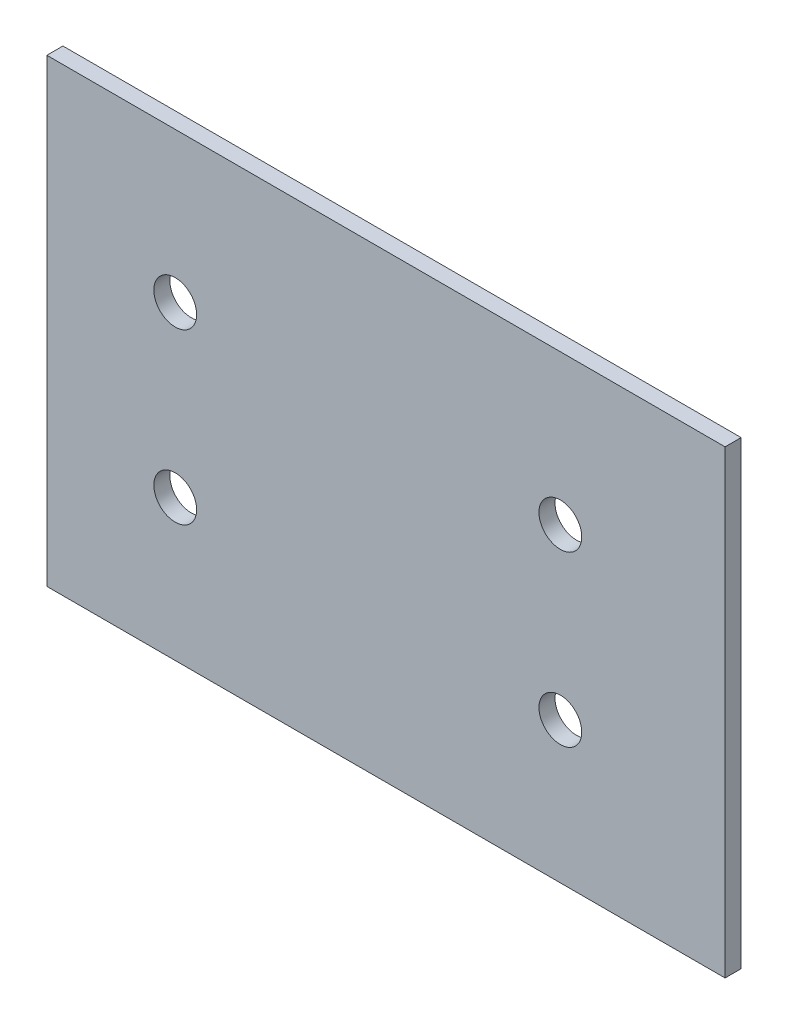
ISO-10303-21;
HEADER;
FILE_DESCRIPTION(('STEP AP214'),'2;1');
FILE_NAME('part.step','',(''),(''),'','','');
FILE_SCHEMA(('AUTOMOTIVE_DESIGN { 1 0 10303 214 1 1 1 1 }'));
ENDSEC;
DATA;
#1=APPLICATION_CONTEXT('core data for automotive mechanical design processes');
#2=APPLICATION_PROTOCOL_DEFINITION('international standard','automotive_design',2000,#1);
#3=PRODUCT_CONTEXT('',#1,'mechanical');
#4=PRODUCT('Part','Part','',(#3));
#5=PRODUCT_RELATED_PRODUCT_CATEGORY('part','',(#4));
#6=PRODUCT_DEFINITION_FORMATION('','',#4);
#7=PRODUCT_DEFINITION_CONTEXT('part definition',#1,'design');
#8=PRODUCT_DEFINITION('design','',#6,#7);
#9=PRODUCT_DEFINITION_SHAPE('','',#8);
#10=(LENGTH_UNIT() NAMED_UNIT(*) SI_UNIT(.MILLI.,.METRE.));
#11=(NAMED_UNIT(*) PLANE_ANGLE_UNIT() SI_UNIT($,.RADIAN.));
#12=(NAMED_UNIT(*) SI_UNIT($,.STERADIAN.) SOLID_ANGLE_UNIT());
#13=UNCERTAINTY_MEASURE_WITH_UNIT(LENGTH_MEASURE(1.E-05),#10,'distance_accuracy_value','');
#14=(GEOMETRIC_REPRESENTATION_CONTEXT(3) GLOBAL_UNCERTAINTY_ASSIGNED_CONTEXT((#13)) GLOBAL_UNIT_ASSIGNED_CONTEXT((#10,
#11,#12)) REPRESENTATION_CONTEXT('',''));
#15=CARTESIAN_POINT('',(0.,0.,0.));
#16=DIRECTION('',(0.,0.,1.));
#17=DIRECTION('',(1.,0.,0.));
#18=AXIS2_PLACEMENT_3D('',#15,#16,#17);
#19=CARTESIAN_POINT('',(40.259,27.305,1.905));
#20=DIRECTION('',(-1.,0.,0.));
#21=DIRECTION('',(0.,-1.,0.));
#22=AXIS2_PLACEMENT_3D('',#19,#20,#21);
#23=PLANE('',#22);
#24=DIRECTION('',(0.,1.,0.));
#25=VECTOR('',#24,1.);
#26=CARTESIAN_POINT('',(40.259,27.305,0.));
#27=LINE('',#26,#25);
#28=CARTESIAN_POINT('',(40.259,-27.305,0.));
#29=VERTEX_POINT('',#28);
#30=CARTESIAN_POINT('',(40.259,27.305,0.));
#31=VERTEX_POINT('',#30);
#32=EDGE_CURVE('E102',#29,#31,#27,.T.);
#33=ORIENTED_EDGE('',*,*,#32,.T.);
#34=DIRECTION('',(0.,0.,-1.));
#35=VECTOR('',#34,1.);
#36=CARTESIAN_POINT('',(40.259,27.305,1.905));
#37=LINE('',#36,#35);
#38=CARTESIAN_POINT('',(40.259,27.305,1.905));
#39=VERTEX_POINT('',#38);
#40=EDGE_CURVE('E11',#39,#31,#37,.T.);
#41=ORIENTED_EDGE('',*,*,#40,.F.);
#42=DIRECTION('',(0.,1.,0.));
#43=VECTOR('',#42,1.);
#44=CARTESIAN_POINT('',(40.259,27.305,1.905));
#45=LINE('',#44,#43);
#46=CARTESIAN_POINT('',(40.259,-27.305,1.905));
#47=VERTEX_POINT('',#46);
#48=EDGE_CURVE('E90',#47,#39,#45,.T.);
#49=ORIENTED_EDGE('',*,*,#48,.F.);
#50=DIRECTION('',(0.,0.,-1.));
#51=VECTOR('',#50,1.);
#52=CARTESIAN_POINT('',(40.259,-27.305,1.905));
#53=LINE('',#52,#51);
#54=EDGE_CURVE('E98',#47,#29,#53,.T.);
#55=ORIENTED_EDGE('',*,*,#54,.T.);
#56=EDGE_LOOP('',(#33,#41,#49,#55));
#57=FACE_BOUND('',#56,.T.);
#58=ADVANCED_FACE('F39',(#57),#23,.F.);
#59=CARTESIAN_POINT('',(-40.259,27.305,1.905));
#60=DIRECTION('',(0.,-1.,0.));
#61=DIRECTION('',(0.,0.,-1.));
#62=AXIS2_PLACEMENT_3D('',#59,#60,#61);
#63=PLANE('',#62);
#64=DIRECTION('',(-1.,0.,0.));
#65=VECTOR('',#64,1.);
#66=CARTESIAN_POINT('',(-40.259,27.305,0.));
#67=LINE('',#66,#65);
#68=CARTESIAN_POINT('',(-40.259,27.305,0.));
#69=VERTEX_POINT('',#68);
#70=EDGE_CURVE('E94',#31,#69,#67,.T.);
#71=ORIENTED_EDGE('',*,*,#70,.T.);
#72=DIRECTION('',(0.,0.,-1.));
#73=VECTOR('',#72,1.);
#74=CARTESIAN_POINT('',(-40.259,27.305,1.905));
#75=LINE('',#74,#73);
#76=CARTESIAN_POINT('',(-40.259,27.305,1.905));
#77=VERTEX_POINT('',#76);
#78=EDGE_CURVE('E47',#77,#69,#75,.T.);
#79=ORIENTED_EDGE('',*,*,#78,.F.);
#80=DIRECTION('',(-1.,0.,0.));
#81=VECTOR('',#80,1.);
#82=CARTESIAN_POINT('',(-40.259,27.305,1.905));
#83=LINE('',#82,#81);
#84=EDGE_CURVE('E85',#39,#77,#83,.T.);
#85=ORIENTED_EDGE('',*,*,#84,.F.);
#86=ORIENTED_EDGE('',*,*,#40,.T.);
#87=EDGE_LOOP('',(#71,#79,#85,#86));
#88=FACE_BOUND('',#87,.T.);
#89=ADVANCED_FACE('F93',(#88),#63,.F.);
#90=CARTESIAN_POINT('',(-40.259,27.305,1.905));
#91=DIRECTION('',(1.,0.,0.));
#92=DIRECTION('',(0.,0.,-1.));
#93=AXIS2_PLACEMENT_3D('',#90,#91,#92);
#94=PLANE('',#93);
#95=DIRECTION('',(0.,-1.,0.));
#96=VECTOR('',#95,1.);
#97=CARTESIAN_POINT('',(-40.259,27.305,0.));
#98=LINE('',#97,#96);
#99=CARTESIAN_POINT('',(-40.259,-27.305,0.));
#100=VERTEX_POINT('',#99);
#101=EDGE_CURVE('E72',#69,#100,#98,.T.);
#102=ORIENTED_EDGE('',*,*,#101,.T.);
#103=DIRECTION('',(0.,0.,-1.));
#104=VECTOR('',#103,1.);
#105=CARTESIAN_POINT('',(-40.259,-27.305,1.905));
#106=LINE('',#105,#104);
#107=CARTESIAN_POINT('',(-40.259,-27.305,1.905));
#108=VERTEX_POINT('',#107);
#109=EDGE_CURVE('E95',#108,#100,#106,.T.);
#110=ORIENTED_EDGE('',*,*,#109,.F.);
#111=DIRECTION('',(0.,-1.,0.));
#112=VECTOR('',#111,1.);
#113=CARTESIAN_POINT('',(-40.259,27.305,1.905));
#114=LINE('',#113,#112);
#115=EDGE_CURVE('E88',#77,#108,#114,.T.);
#116=ORIENTED_EDGE('',*,*,#115,.F.);
#117=ORIENTED_EDGE('',*,*,#78,.T.);
#118=EDGE_LOOP('',(#102,#110,#116,#117));
#119=FACE_BOUND('',#118,.T.);
#120=ADVANCED_FACE('F96',(#119),#94,.F.);
#121=CARTESIAN_POINT('',(-40.259,-27.305,1.905));
#122=DIRECTION('',(0.,1.,0.));
#123=DIRECTION('',(0.,0.,1.));
#124=AXIS2_PLACEMENT_3D('',#121,#122,#123);
#125=PLANE('',#124);
#126=DIRECTION('',(1.,0.,0.));
#127=VECTOR('',#126,1.);
#128=CARTESIAN_POINT('',(-40.259,-27.305,0.));
#129=LINE('',#128,#127);
#130=EDGE_CURVE('E78',#100,#29,#129,.T.);
#131=ORIENTED_EDGE('',*,*,#130,.T.);
#132=ORIENTED_EDGE('',*,*,#54,.F.);
#133=DIRECTION('',(1.,0.,0.));
#134=VECTOR('',#133,1.);
#135=CARTESIAN_POINT('',(-40.259,-27.305,1.905));
#136=LINE('',#135,#134);
#137=EDGE_CURVE('E55',#108,#47,#136,.T.);
#138=ORIENTED_EDGE('',*,*,#137,.F.);
#139=ORIENTED_EDGE('',*,*,#109,.T.);
#140=EDGE_LOOP('',(#131,#132,#138,#139));
#141=FACE_BOUND('',#140,.T.);
#142=ADVANCED_FACE('F110',(#141),#125,.F.);
#143=CARTESIAN_POINT('',(0.,0.,1.905));
#144=DIRECTION('',(0.,0.,1.));
#145=DIRECTION('',(1.,0.,0.));
#146=AXIS2_PLACEMENT_3D('',#143,#144,#145);
#147=PLANE('',#146);
#148=CARTESIAN_POINT('',(-25.019,-10.541,1.905));
#149=DIRECTION('',(0.,0.,1.));
#150=DIRECTION('',(1.,0.,0.));
#151=AXIS2_PLACEMENT_3D('',#148,#149,#150);
#152=CIRCLE('',#151,2.54);
#153=CARTESIAN_POINT('',(-22.479,-10.541,1.905));
#154=VERTEX_POINT('',#153);
#155=EDGE_CURVE('E119',#154,#154,#152,.T.);
#156=ORIENTED_EDGE('',*,*,#155,.F.);
#157=EDGE_LOOP('',(#156));
#158=FACE_BOUND('',#157,.T.);
#159=CARTESIAN_POINT('',(20.701,9.52500000000001,1.905));
#160=DIRECTION('',(0.,0.,1.));
#161=DIRECTION('',(1.,0.,0.));
#162=AXIS2_PLACEMENT_3D('',#159,#160,#161);
#163=CIRCLE('',#162,2.54);
#164=CARTESIAN_POINT('',(23.241,9.52500000000001,1.905));
#165=VERTEX_POINT('',#164);
#166=EDGE_CURVE('E125',#165,#165,#163,.T.);
#167=ORIENTED_EDGE('',*,*,#166,.F.);
#168=EDGE_LOOP('',(#167));
#169=FACE_BOUND('',#168,.T.);
#170=CARTESIAN_POINT('',(20.701,-10.541,1.905));
#171=DIRECTION('',(0.,0.,1.));
#172=DIRECTION('',(1.,0.,0.));
#173=AXIS2_PLACEMENT_3D('',#170,#171,#172);
#174=CIRCLE('',#173,2.54);
#175=CARTESIAN_POINT('',(23.241,-10.541,1.905));
#176=VERTEX_POINT('',#175);
#177=EDGE_CURVE('E126',#176,#176,#174,.T.);
#178=ORIENTED_EDGE('',*,*,#177,.F.);
#179=EDGE_LOOP('',(#178));
#180=FACE_BOUND('',#179,.T.);
#181=CARTESIAN_POINT('',(-25.019,9.52500000000001,1.905));
#182=DIRECTION('',(0.,0.,1.));
#183=DIRECTION('',(1.,0.,0.));
#184=AXIS2_PLACEMENT_3D('',#181,#182,#183);
#185=CIRCLE('',#184,2.54);
#186=CARTESIAN_POINT('',(-22.479,9.52500000000001,1.905));
#187=VERTEX_POINT('',#186);
#188=EDGE_CURVE('E116',#187,#187,#185,.T.);
#189=ORIENTED_EDGE('',*,*,#188,.F.);
#190=EDGE_LOOP('',(#189));
#191=FACE_BOUND('',#190,.T.);
#192=ORIENTED_EDGE('',*,*,#48,.T.);
#193=ORIENTED_EDGE('',*,*,#84,.T.);
#194=ORIENTED_EDGE('',*,*,#115,.T.);
#195=ORIENTED_EDGE('',*,*,#137,.T.);
#196=EDGE_LOOP('',(#192,#193,#194,#195));
#197=FACE_BOUND('',#196,.T.);
#198=ADVANCED_FACE('F86',(#158,#169,#180,#191,#197),#147,.T.);
#199=CARTESIAN_POINT('',(0.,0.,0.));
#200=DIRECTION('',(0.,0.,1.));
#201=DIRECTION('',(1.,0.,0.));
#202=AXIS2_PLACEMENT_3D('',#199,#200,#201);
#203=PLANE('',#202);
#204=CARTESIAN_POINT('',(-25.019,-10.541,0.));
#205=DIRECTION('',(0.,0.,1.));
#206=DIRECTION('',(1.,0.,0.));
#207=AXIS2_PLACEMENT_3D('',#204,#205,#206);
#208=CIRCLE('',#207,2.54);
#209=CARTESIAN_POINT('',(-22.479,-10.541,0.));
#210=VERTEX_POINT('',#209);
#211=EDGE_CURVE('E129',#210,#210,#208,.T.);
#212=ORIENTED_EDGE('',*,*,#211,.T.);
#213=EDGE_LOOP('',(#212));
#214=FACE_BOUND('',#213,.T.);
#215=CARTESIAN_POINT('',(20.701,9.52500000000001,0.));
#216=DIRECTION('',(0.,0.,1.));
#217=DIRECTION('',(1.,0.,0.));
#218=AXIS2_PLACEMENT_3D('',#215,#216,#217);
#219=CIRCLE('',#218,2.54);
#220=CARTESIAN_POINT('',(23.241,9.52500000000001,0.));
#221=VERTEX_POINT('',#220);
#222=EDGE_CURVE('E122',#221,#221,#219,.T.);
#223=ORIENTED_EDGE('',*,*,#222,.T.);
#224=EDGE_LOOP('',(#223));
#225=FACE_BOUND('',#224,.T.);
#226=CARTESIAN_POINT('',(20.701,-10.541,0.));
#227=DIRECTION('',(0.,0.,1.));
#228=DIRECTION('',(1.,0.,0.));
#229=AXIS2_PLACEMENT_3D('',#226,#227,#228);
#230=CIRCLE('',#229,2.54);
#231=CARTESIAN_POINT('',(23.241,-10.541,0.));
#232=VERTEX_POINT('',#231);
#233=EDGE_CURVE('E134',#232,#232,#230,.T.);
#234=ORIENTED_EDGE('',*,*,#233,.T.);
#235=EDGE_LOOP('',(#234));
#236=FACE_BOUND('',#235,.T.);
#237=CARTESIAN_POINT('',(-25.019,9.52500000000001,0.));
#238=DIRECTION('',(0.,0.,1.));
#239=DIRECTION('',(1.,0.,0.));
#240=AXIS2_PLACEMENT_3D('',#237,#238,#239);
#241=CIRCLE('',#240,2.54);
#242=CARTESIAN_POINT('',(-22.479,9.52500000000001,0.));
#243=VERTEX_POINT('',#242);
#244=EDGE_CURVE('E105',#243,#243,#241,.T.);
#245=ORIENTED_EDGE('',*,*,#244,.T.);
#246=EDGE_LOOP('',(#245));
#247=FACE_BOUND('',#246,.T.);
#248=ORIENTED_EDGE('',*,*,#32,.F.);
#249=ORIENTED_EDGE('',*,*,#130,.F.);
#250=ORIENTED_EDGE('',*,*,#101,.F.);
#251=ORIENTED_EDGE('',*,*,#70,.F.);
#252=EDGE_LOOP('',(#248,#249,#250,#251));
#253=FACE_BOUND('',#252,.T.);
#254=ADVANCED_FACE('F113',(#214,#225,#236,#247,#253),#203,.F.);
#255=CARTESIAN_POINT('',(-25.019,9.52500000000001,0.));
#256=DIRECTION('',(0.,0.,1.));
#257=DIRECTION('',(1.,0.,0.));
#258=AXIS2_PLACEMENT_3D('',#255,#256,#257);
#259=CYLINDRICAL_SURFACE('',#258,2.54);
#260=CARTESIAN_POINT('',(-22.479,9.52500000000001,0.));
#261=CARTESIAN_POINT('',(-22.479,9.52500000000001,0.01984375));
#262=CARTESIAN_POINT('',(-22.479,9.52500000000001,0.0396875));
#263=CARTESIAN_POINT('',(-22.479,9.52500000000001,0.079375));
#264=CARTESIAN_POINT('',(-22.479,9.52500000000001,0.09921875));
#265=CARTESIAN_POINT('',(-22.479,9.52500000000001,0.13890625));
#266=CARTESIAN_POINT('',(-22.479,9.52500000000001,0.15875));
#267=CARTESIAN_POINT('',(-22.479,9.52500000000001,0.1984375));
#268=CARTESIAN_POINT('',(-22.479,9.52500000000001,0.21828125));
#269=CARTESIAN_POINT('',(-22.479,9.52500000000001,0.25796875));
#270=CARTESIAN_POINT('',(-22.479,9.52500000000001,0.2778125));
#271=CARTESIAN_POINT('',(-22.479,9.52500000000001,0.3175));
#272=CARTESIAN_POINT('',(-22.479,9.52500000000001,0.33734375));
#273=CARTESIAN_POINT('',(-22.479,9.52500000000001,0.37703125));
#274=CARTESIAN_POINT('',(-22.479,9.52500000000001,0.396875));
#275=CARTESIAN_POINT('',(-22.479,9.52500000000001,0.4365625));
#276=CARTESIAN_POINT('',(-22.479,9.52500000000001,0.45640625));
#277=CARTESIAN_POINT('',(-22.479,9.52500000000001,0.49609375));
#278=CARTESIAN_POINT('',(-22.479,9.52500000000001,0.5159375));
#279=CARTESIAN_POINT('',(-22.479,9.52500000000001,0.555625));
#280=CARTESIAN_POINT('',(-22.479,9.52500000000001,0.57546875));
#281=CARTESIAN_POINT('',(-22.479,9.52500000000001,0.61515625));
#282=CARTESIAN_POINT('',(-22.479,9.52500000000001,0.635));
#283=CARTESIAN_POINT('',(-22.479,9.52500000000001,0.6746875));
#284=CARTESIAN_POINT('',(-22.479,9.52500000000001,0.69453125));
#285=CARTESIAN_POINT('',(-22.479,9.52500000000001,0.73421875));
#286=CARTESIAN_POINT('',(-22.479,9.52500000000001,0.7540625));
#287=CARTESIAN_POINT('',(-22.479,9.52500000000001,0.79375));
#288=CARTESIAN_POINT('',(-22.479,9.52500000000001,0.81359375));
#289=CARTESIAN_POINT('',(-22.479,9.52500000000001,0.85328125));
#290=CARTESIAN_POINT('',(-22.479,9.52500000000001,0.873125));
#291=CARTESIAN_POINT('',(-22.479,9.52500000000001,0.9128125));
#292=CARTESIAN_POINT('',(-22.479,9.52500000000001,0.93265625));
#293=CARTESIAN_POINT('',(-22.479,9.52500000000001,0.97234375));
#294=CARTESIAN_POINT('',(-22.479,9.52500000000001,0.9921875));
#295=CARTESIAN_POINT('',(-22.479,9.52500000000001,1.031875));
#296=CARTESIAN_POINT('',(-22.479,9.52500000000001,1.05171875));
#297=CARTESIAN_POINT('',(-22.479,9.52500000000001,1.09140625));
#298=CARTESIAN_POINT('',(-22.479,9.52500000000001,1.11125));
#299=CARTESIAN_POINT('',(-22.479,9.52500000000001,1.1509375));
#300=CARTESIAN_POINT('',(-22.479,9.52500000000001,1.17078125));
#301=CARTESIAN_POINT('',(-22.479,9.52500000000001,1.21046875));
#302=CARTESIAN_POINT('',(-22.479,9.52500000000001,1.2303125));
#303=CARTESIAN_POINT('',(-22.479,9.52500000000001,1.27));
#304=CARTESIAN_POINT('',(-22.479,9.52500000000001,1.28984375));
#305=CARTESIAN_POINT('',(-22.479,9.52500000000001,1.32953125));
#306=CARTESIAN_POINT('',(-22.479,9.52500000000001,1.349375));
#307=CARTESIAN_POINT('',(-22.479,9.52500000000001,1.3890625));
#308=CARTESIAN_POINT('',(-22.479,9.52500000000001,1.40890625));
#309=CARTESIAN_POINT('',(-22.479,9.52500000000001,1.44859375));
#310=CARTESIAN_POINT('',(-22.479,9.52500000000001,1.4684375));
#311=CARTESIAN_POINT('',(-22.479,9.52500000000001,1.508125));
#312=CARTESIAN_POINT('',(-22.479,9.52500000000001,1.52796875));
#313=CARTESIAN_POINT('',(-22.479,9.52500000000001,1.56765625));
#314=CARTESIAN_POINT('',(-22.479,9.52500000000001,1.5875));
#315=CARTESIAN_POINT('',(-22.479,9.52500000000001,1.6271875));
#316=CARTESIAN_POINT('',(-22.479,9.52500000000001,1.64703125));
#317=CARTESIAN_POINT('',(-22.479,9.52500000000001,1.68671875));
#318=CARTESIAN_POINT('',(-22.479,9.52500000000001,1.7065625));
#319=CARTESIAN_POINT('',(-22.479,9.52500000000001,1.74625));
#320=CARTESIAN_POINT('',(-22.479,9.52500000000001,1.76609375));
#321=CARTESIAN_POINT('',(-22.479,9.52500000000001,1.80578125));
#322=CARTESIAN_POINT('',(-22.479,9.52500000000001,1.825625));
#323=CARTESIAN_POINT('',(-22.479,9.52500000000001,1.8653125));
#324=CARTESIAN_POINT('',(-22.479,9.52500000000001,1.88515625));
#325=CARTESIAN_POINT('',(-22.479,9.52500000000001,1.905));
#326=B_SPLINE_CURVE_WITH_KNOTS('',3,(#260,#261,#262,#263,#264,#265,#266,#267,#268,#269,#270,
#271,#272,#273,#274,#275,#276,#277,#278,#279,#280,#281,#282,#283,#284,#285,#286,#287,#288,#289,
#290,#291,#292,#293,#294,#295,#296,#297,#298,#299,#300,#301,#302,#303,#304,#305,#306,#307,#308,
#309,#310,#311,#312,#313,#314,#315,#316,#317,#318,#319,#320,#321,#322,#323,#324,#325),
.UNSPECIFIED.,.F.,.F.,(4,2,2,2,2,2,2,2,2,2,2,2,2,2,2,2,2,2,2,2,2,2,2,2,2,2,2,2,2,2,2,2,4),(0.,
0.05953125,0.1190625,0.17859375,0.238125,0.29765625,0.3571875,0.41671875,0.47625,0.53578125,
0.5953125,0.65484375,0.714375,0.77390625,0.8334375,0.89296875,0.9525,1.01203125,1.0715625,
1.13109375,1.190625,1.25015625,1.3096875,1.36921875,1.42875,1.48828125,1.5478125,1.60734375,
1.666875,1.72640625,1.7859375,1.84546875,1.905),.UNSPECIFIED.);
#327=EDGE_CURVE('BSEAM148',#243,#187,#326,.T.);
#328=ORIENTED_EDGE('',*,*,#244,.F.);
#329=ORIENTED_EDGE('',*,*,#188,.T.);
#330=ORIENTED_EDGE('',*,*,#327,.T.);
#331=ORIENTED_EDGE('',*,*,#327,.F.);
#332=EDGE_LOOP('',(#328,#330,#329,#331));
#333=FACE_BOUND('',#332,.T.);
#334=ADVANCED_FACE('F148',(#333),#259,.F.);
#335=CARTESIAN_POINT('',(20.701,-10.541,0.));
#336=DIRECTION('',(0.,0.,1.));
#337=DIRECTION('',(1.,0.,0.));
#338=AXIS2_PLACEMENT_3D('',#335,#336,#337);
#339=CYLINDRICAL_SURFACE('',#338,2.54);
#340=CARTESIAN_POINT('',(23.241,-10.541,0.));
#341=CARTESIAN_POINT('',(23.241,-10.541,0.01984375));
#342=CARTESIAN_POINT('',(23.241,-10.541,0.0396875));
#343=CARTESIAN_POINT('',(23.241,-10.541,0.079375));
#344=CARTESIAN_POINT('',(23.241,-10.541,0.09921875));
#345=CARTESIAN_POINT('',(23.241,-10.541,0.13890625));
#346=CARTESIAN_POINT('',(23.241,-10.541,0.15875));
#347=CARTESIAN_POINT('',(23.241,-10.541,0.1984375));
#348=CARTESIAN_POINT('',(23.241,-10.541,0.21828125));
#349=CARTESIAN_POINT('',(23.241,-10.541,0.25796875));
#350=CARTESIAN_POINT('',(23.241,-10.541,0.2778125));
#351=CARTESIAN_POINT('',(23.241,-10.541,0.3175));
#352=CARTESIAN_POINT('',(23.241,-10.541,0.33734375));
#353=CARTESIAN_POINT('',(23.241,-10.541,0.37703125));
#354=CARTESIAN_POINT('',(23.241,-10.541,0.396875));
#355=CARTESIAN_POINT('',(23.241,-10.541,0.4365625));
#356=CARTESIAN_POINT('',(23.241,-10.541,0.45640625));
#357=CARTESIAN_POINT('',(23.241,-10.541,0.49609375));
#358=CARTESIAN_POINT('',(23.241,-10.541,0.5159375));
#359=CARTESIAN_POINT('',(23.241,-10.541,0.555625));
#360=CARTESIAN_POINT('',(23.241,-10.541,0.57546875));
#361=CARTESIAN_POINT('',(23.241,-10.541,0.61515625));
#362=CARTESIAN_POINT('',(23.241,-10.541,0.635));
#363=CARTESIAN_POINT('',(23.241,-10.541,0.6746875));
#364=CARTESIAN_POINT('',(23.241,-10.541,0.69453125));
#365=CARTESIAN_POINT('',(23.241,-10.541,0.73421875));
#366=CARTESIAN_POINT('',(23.241,-10.541,0.7540625));
#367=CARTESIAN_POINT('',(23.241,-10.541,0.79375));
#368=CARTESIAN_POINT('',(23.241,-10.541,0.81359375));
#369=CARTESIAN_POINT('',(23.241,-10.541,0.85328125));
#370=CARTESIAN_POINT('',(23.241,-10.541,0.873125));
#371=CARTESIAN_POINT('',(23.241,-10.541,0.9128125));
#372=CARTESIAN_POINT('',(23.241,-10.541,0.93265625));
#373=CARTESIAN_POINT('',(23.241,-10.541,0.97234375));
#374=CARTESIAN_POINT('',(23.241,-10.541,0.9921875));
#375=CARTESIAN_POINT('',(23.241,-10.541,1.031875));
#376=CARTESIAN_POINT('',(23.241,-10.541,1.05171875));
#377=CARTESIAN_POINT('',(23.241,-10.541,1.09140625));
#378=CARTESIAN_POINT('',(23.241,-10.541,1.11125));
#379=CARTESIAN_POINT('',(23.241,-10.541,1.1509375));
#380=CARTESIAN_POINT('',(23.241,-10.541,1.17078125));
#381=CARTESIAN_POINT('',(23.241,-10.541,1.21046875));
#382=CARTESIAN_POINT('',(23.241,-10.541,1.2303125));
#383=CARTESIAN_POINT('',(23.241,-10.541,1.27));
#384=CARTESIAN_POINT('',(23.241,-10.541,1.28984375));
#385=CARTESIAN_POINT('',(23.241,-10.541,1.32953125));
#386=CARTESIAN_POINT('',(23.241,-10.541,1.349375));
#387=CARTESIAN_POINT('',(23.241,-10.541,1.3890625));
#388=CARTESIAN_POINT('',(23.241,-10.541,1.40890625));
#389=CARTESIAN_POINT('',(23.241,-10.541,1.44859375));
#390=CARTESIAN_POINT('',(23.241,-10.541,1.4684375));
#391=CARTESIAN_POINT('',(23.241,-10.541,1.508125));
#392=CARTESIAN_POINT('',(23.241,-10.541,1.52796875));
#393=CARTESIAN_POINT('',(23.241,-10.541,1.56765625));
#394=CARTESIAN_POINT('',(23.241,-10.541,1.5875));
#395=CARTESIAN_POINT('',(23.241,-10.541,1.6271875));
#396=CARTESIAN_POINT('',(23.241,-10.541,1.64703125));
#397=CARTESIAN_POINT('',(23.241,-10.541,1.68671875));
#398=CARTESIAN_POINT('',(23.241,-10.541,1.7065625));
#399=CARTESIAN_POINT('',(23.241,-10.541,1.74625));
#400=CARTESIAN_POINT('',(23.241,-10.541,1.76609375));
#401=CARTESIAN_POINT('',(23.241,-10.541,1.80578125));
#402=CARTESIAN_POINT('',(23.241,-10.541,1.825625));
#403=CARTESIAN_POINT('',(23.241,-10.541,1.8653125));
#404=CARTESIAN_POINT('',(23.241,-10.541,1.88515625));
#405=CARTESIAN_POINT('',(23.241,-10.541,1.905));
#406=B_SPLINE_CURVE_WITH_KNOTS('',3,(#340,#341,#342,#343,#344,#345,#346,#347,#348,#349,#350,
#351,#352,#353,#354,#355,#356,#357,#358,#359,#360,#361,#362,#363,#364,#365,#366,#367,#368,#369,
#370,#371,#372,#373,#374,#375,#376,#377,#378,#379,#380,#381,#382,#383,#384,#385,#386,#387,#388,
#389,#390,#391,#392,#393,#394,#395,#396,#397,#398,#399,#400,#401,#402,#403,#404,#405),
.UNSPECIFIED.,.F.,.F.,(4,2,2,2,2,2,2,2,2,2,2,2,2,2,2,2,2,2,2,2,2,2,2,2,2,2,2,2,2,2,2,2,4),(0.,
0.05953125,0.1190625,0.17859375,0.238125,0.29765625,0.3571875,0.41671875,0.47625,0.53578125,
0.5953125,0.65484375,0.714375,0.77390625,0.8334375,0.89296875,0.9525,1.01203125,1.0715625,
1.13109375,1.190625,1.25015625,1.3096875,1.36921875,1.42875,1.48828125,1.5478125,1.60734375,
1.666875,1.72640625,1.7859375,1.84546875,1.905),.UNSPECIFIED.);
#407=EDGE_CURVE('BSEAM140',#232,#176,#406,.T.);
#408=ORIENTED_EDGE('',*,*,#233,.F.);
#409=ORIENTED_EDGE('',*,*,#177,.T.);
#410=ORIENTED_EDGE('',*,*,#407,.T.);
#411=ORIENTED_EDGE('',*,*,#407,.F.);
#412=EDGE_LOOP('',(#408,#410,#409,#411));
#413=FACE_BOUND('',#412,.T.);
#414=ADVANCED_FACE('F140',(#413),#339,.F.);
#415=CARTESIAN_POINT('',(20.701,9.52500000000001,0.));
#416=DIRECTION('',(0.,0.,1.));
#417=DIRECTION('',(1.,0.,0.));
#418=AXIS2_PLACEMENT_3D('',#415,#416,#417);
#419=CYLINDRICAL_SURFACE('',#418,2.54);
#420=CARTESIAN_POINT('',(23.241,9.52500000000001,0.));
#421=CARTESIAN_POINT('',(23.241,9.52500000000001,0.01984375));
#422=CARTESIAN_POINT('',(23.241,9.52500000000001,0.0396875));
#423=CARTESIAN_POINT('',(23.241,9.52500000000001,0.079375));
#424=CARTESIAN_POINT('',(23.241,9.52500000000001,0.09921875));
#425=CARTESIAN_POINT('',(23.241,9.52500000000001,0.13890625));
#426=CARTESIAN_POINT('',(23.241,9.52500000000001,0.15875));
#427=CARTESIAN_POINT('',(23.241,9.52500000000001,0.1984375));
#428=CARTESIAN_POINT('',(23.241,9.52500000000001,0.21828125));
#429=CARTESIAN_POINT('',(23.241,9.52500000000001,0.25796875));
#430=CARTESIAN_POINT('',(23.241,9.52500000000001,0.2778125));
#431=CARTESIAN_POINT('',(23.241,9.52500000000001,0.3175));
#432=CARTESIAN_POINT('',(23.241,9.52500000000001,0.33734375));
#433=CARTESIAN_POINT('',(23.241,9.52500000000001,0.37703125));
#434=CARTESIAN_POINT('',(23.241,9.52500000000001,0.396875));
#435=CARTESIAN_POINT('',(23.241,9.52500000000001,0.4365625));
#436=CARTESIAN_POINT('',(23.241,9.52500000000001,0.45640625));
#437=CARTESIAN_POINT('',(23.241,9.52500000000001,0.49609375));
#438=CARTESIAN_POINT('',(23.241,9.52500000000001,0.5159375));
#439=CARTESIAN_POINT('',(23.241,9.52500000000001,0.555625));
#440=CARTESIAN_POINT('',(23.241,9.52500000000001,0.57546875));
#441=CARTESIAN_POINT('',(23.241,9.52500000000001,0.61515625));
#442=CARTESIAN_POINT('',(23.241,9.52500000000001,0.635));
#443=CARTESIAN_POINT('',(23.241,9.52500000000001,0.6746875));
#444=CARTESIAN_POINT('',(23.241,9.52500000000001,0.69453125));
#445=CARTESIAN_POINT('',(23.241,9.52500000000001,0.73421875));
#446=CARTESIAN_POINT('',(23.241,9.52500000000001,0.7540625));
#447=CARTESIAN_POINT('',(23.241,9.52500000000001,0.79375));
#448=CARTESIAN_POINT('',(23.241,9.52500000000001,0.81359375));
#449=CARTESIAN_POINT('',(23.241,9.52500000000001,0.85328125));
#450=CARTESIAN_POINT('',(23.241,9.52500000000001,0.873125));
#451=CARTESIAN_POINT('',(23.241,9.52500000000001,0.9128125));
#452=CARTESIAN_POINT('',(23.241,9.52500000000001,0.93265625));
#453=CARTESIAN_POINT('',(23.241,9.52500000000001,0.97234375));
#454=CARTESIAN_POINT('',(23.241,9.52500000000001,0.9921875));
#455=CARTESIAN_POINT('',(23.241,9.52500000000001,1.031875));
#456=CARTESIAN_POINT('',(23.241,9.52500000000001,1.05171875));
#457=CARTESIAN_POINT('',(23.241,9.52500000000001,1.09140625));
#458=CARTESIAN_POINT('',(23.241,9.52500000000001,1.11125));
#459=CARTESIAN_POINT('',(23.241,9.52500000000001,1.1509375));
#460=CARTESIAN_POINT('',(23.241,9.52500000000001,1.17078125));
#461=CARTESIAN_POINT('',(23.241,9.52500000000001,1.21046875));
#462=CARTESIAN_POINT('',(23.241,9.52500000000001,1.2303125));
#463=CARTESIAN_POINT('',(23.241,9.52500000000001,1.27));
#464=CARTESIAN_POINT('',(23.241,9.52500000000001,1.28984375));
#465=CARTESIAN_POINT('',(23.241,9.52500000000001,1.32953125));
#466=CARTESIAN_POINT('',(23.241,9.52500000000001,1.349375));
#467=CARTESIAN_POINT('',(23.241,9.52500000000001,1.3890625));
#468=CARTESIAN_POINT('',(23.241,9.52500000000001,1.40890625));
#469=CARTESIAN_POINT('',(23.241,9.52500000000001,1.44859375));
#470=CARTESIAN_POINT('',(23.241,9.52500000000001,1.4684375));
#471=CARTESIAN_POINT('',(23.241,9.52500000000001,1.508125));
#472=CARTESIAN_POINT('',(23.241,9.52500000000001,1.52796875));
#473=CARTESIAN_POINT('',(23.241,9.52500000000001,1.56765625));
#474=CARTESIAN_POINT('',(23.241,9.52500000000001,1.5875));
#475=CARTESIAN_POINT('',(23.241,9.52500000000001,1.6271875));
#476=CARTESIAN_POINT('',(23.241,9.52500000000001,1.64703125));
#477=CARTESIAN_POINT('',(23.241,9.52500000000001,1.68671875));
#478=CARTESIAN_POINT('',(23.241,9.52500000000001,1.7065625));
#479=CARTESIAN_POINT('',(23.241,9.52500000000001,1.74625));
#480=CARTESIAN_POINT('',(23.241,9.52500000000001,1.76609375));
#481=CARTESIAN_POINT('',(23.241,9.52500000000001,1.80578125));
#482=CARTESIAN_POINT('',(23.241,9.52500000000001,1.825625));
#483=CARTESIAN_POINT('',(23.241,9.52500000000001,1.8653125));
#484=CARTESIAN_POINT('',(23.241,9.52500000000001,1.88515625));
#485=CARTESIAN_POINT('',(23.241,9.52500000000001,1.905));
#486=B_SPLINE_CURVE_WITH_KNOTS('',3,(#420,#421,#422,#423,#424,#425,#426,#427,#428,#429,#430,
#431,#432,#433,#434,#435,#436,#437,#438,#439,#440,#441,#442,#443,#444,#445,#446,#447,#448,#449,
#450,#451,#452,#453,#454,#455,#456,#457,#458,#459,#460,#461,#462,#463,#464,#465,#466,#467,#468,
#469,#470,#471,#472,#473,#474,#475,#476,#477,#478,#479,#480,#481,#482,#483,#484,#485),
.UNSPECIFIED.,.F.,.F.,(4,2,2,2,2,2,2,2,2,2,2,2,2,2,2,2,2,2,2,2,2,2,2,2,2,2,2,2,2,2,2,2,4),(0.,
0.05953125,0.1190625,0.17859375,0.238125,0.29765625,0.3571875,0.41671875,0.47625,0.53578125,
0.5953125,0.65484375,0.714375,0.77390625,0.8334375,0.89296875,0.9525,1.01203125,1.0715625,
1.13109375,1.190625,1.25015625,1.3096875,1.36921875,1.42875,1.48828125,1.5478125,1.60734375,
1.666875,1.72640625,1.7859375,1.84546875,1.905),.UNSPECIFIED.);
#487=EDGE_CURVE('BSEAM156',#221,#165,#486,.T.);
#488=ORIENTED_EDGE('',*,*,#222,.F.);
#489=ORIENTED_EDGE('',*,*,#166,.T.);
#490=ORIENTED_EDGE('',*,*,#487,.T.);
#491=ORIENTED_EDGE('',*,*,#487,.F.);
#492=EDGE_LOOP('',(#488,#490,#489,#491));
#493=FACE_BOUND('',#492,.T.);
#494=ADVANCED_FACE('F156',(#493),#419,.F.);
#495=CARTESIAN_POINT('',(-25.019,-10.541,0.));
#496=DIRECTION('',(0.,0.,1.));
#497=DIRECTION('',(1.,0.,0.));
#498=AXIS2_PLACEMENT_3D('',#495,#496,#497);
#499=CYLINDRICAL_SURFACE('',#498,2.54);
#500=CARTESIAN_POINT('',(-22.479,-10.541,0.));
#501=CARTESIAN_POINT('',(-22.479,-10.541,0.01984375));
#502=CARTESIAN_POINT('',(-22.479,-10.541,0.0396875));
#503=CARTESIAN_POINT('',(-22.479,-10.541,0.079375));
#504=CARTESIAN_POINT('',(-22.479,-10.541,0.09921875));
#505=CARTESIAN_POINT('',(-22.479,-10.541,0.13890625));
#506=CARTESIAN_POINT('',(-22.479,-10.541,0.15875));
#507=CARTESIAN_POINT('',(-22.479,-10.541,0.1984375));
#508=CARTESIAN_POINT('',(-22.479,-10.541,0.21828125));
#509=CARTESIAN_POINT('',(-22.479,-10.541,0.25796875));
#510=CARTESIAN_POINT('',(-22.479,-10.541,0.2778125));
#511=CARTESIAN_POINT('',(-22.479,-10.541,0.3175));
#512=CARTESIAN_POINT('',(-22.479,-10.541,0.33734375));
#513=CARTESIAN_POINT('',(-22.479,-10.541,0.37703125));
#514=CARTESIAN_POINT('',(-22.479,-10.541,0.396875));
#515=CARTESIAN_POINT('',(-22.479,-10.541,0.4365625));
#516=CARTESIAN_POINT('',(-22.479,-10.541,0.45640625));
#517=CARTESIAN_POINT('',(-22.479,-10.541,0.49609375));
#518=CARTESIAN_POINT('',(-22.479,-10.541,0.5159375));
#519=CARTESIAN_POINT('',(-22.479,-10.541,0.555625));
#520=CARTESIAN_POINT('',(-22.479,-10.541,0.57546875));
#521=CARTESIAN_POINT('',(-22.479,-10.541,0.61515625));
#522=CARTESIAN_POINT('',(-22.479,-10.541,0.635));
#523=CARTESIAN_POINT('',(-22.479,-10.541,0.6746875));
#524=CARTESIAN_POINT('',(-22.479,-10.541,0.69453125));
#525=CARTESIAN_POINT('',(-22.479,-10.541,0.73421875));
#526=CARTESIAN_POINT('',(-22.479,-10.541,0.7540625));
#527=CARTESIAN_POINT('',(-22.479,-10.541,0.79375));
#528=CARTESIAN_POINT('',(-22.479,-10.541,0.81359375));
#529=CARTESIAN_POINT('',(-22.479,-10.541,0.85328125));
#530=CARTESIAN_POINT('',(-22.479,-10.541,0.873125));
#531=CARTESIAN_POINT('',(-22.479,-10.541,0.9128125));
#532=CARTESIAN_POINT('',(-22.479,-10.541,0.93265625));
#533=CARTESIAN_POINT('',(-22.479,-10.541,0.97234375));
#534=CARTESIAN_POINT('',(-22.479,-10.541,0.9921875));
#535=CARTESIAN_POINT('',(-22.479,-10.541,1.031875));
#536=CARTESIAN_POINT('',(-22.479,-10.541,1.05171875));
#537=CARTESIAN_POINT('',(-22.479,-10.541,1.09140625));
#538=CARTESIAN_POINT('',(-22.479,-10.541,1.11125));
#539=CARTESIAN_POINT('',(-22.479,-10.541,1.1509375));
#540=CARTESIAN_POINT('',(-22.479,-10.541,1.17078125));
#541=CARTESIAN_POINT('',(-22.479,-10.541,1.21046875));
#542=CARTESIAN_POINT('',(-22.479,-10.541,1.2303125));
#543=CARTESIAN_POINT('',(-22.479,-10.541,1.27));
#544=CARTESIAN_POINT('',(-22.479,-10.541,1.28984375));
#545=CARTESIAN_POINT('',(-22.479,-10.541,1.32953125));
#546=CARTESIAN_POINT('',(-22.479,-10.541,1.349375));
#547=CARTESIAN_POINT('',(-22.479,-10.541,1.3890625));
#548=CARTESIAN_POINT('',(-22.479,-10.541,1.40890625));
#549=CARTESIAN_POINT('',(-22.479,-10.541,1.44859375));
#550=CARTESIAN_POINT('',(-22.479,-10.541,1.4684375));
#551=CARTESIAN_POINT('',(-22.479,-10.541,1.508125));
#552=CARTESIAN_POINT('',(-22.479,-10.541,1.52796875));
#553=CARTESIAN_POINT('',(-22.479,-10.541,1.56765625));
#554=CARTESIAN_POINT('',(-22.479,-10.541,1.5875));
#555=CARTESIAN_POINT('',(-22.479,-10.541,1.6271875));
#556=CARTESIAN_POINT('',(-22.479,-10.541,1.64703125));
#557=CARTESIAN_POINT('',(-22.479,-10.541,1.68671875));
#558=CARTESIAN_POINT('',(-22.479,-10.541,1.7065625));
#559=CARTESIAN_POINT('',(-22.479,-10.541,1.74625));
#560=CARTESIAN_POINT('',(-22.479,-10.541,1.76609375));
#561=CARTESIAN_POINT('',(-22.479,-10.541,1.80578125));
#562=CARTESIAN_POINT('',(-22.479,-10.541,1.825625));
#563=CARTESIAN_POINT('',(-22.479,-10.541,1.8653125));
#564=CARTESIAN_POINT('',(-22.479,-10.541,1.88515625));
#565=CARTESIAN_POINT('',(-22.479,-10.541,1.905));
#566=B_SPLINE_CURVE_WITH_KNOTS('',3,(#500,#501,#502,#503,#504,#505,#506,#507,#508,#509,#510,
#511,#512,#513,#514,#515,#516,#517,#518,#519,#520,#521,#522,#523,#524,#525,#526,#527,#528,#529,
#530,#531,#532,#533,#534,#535,#536,#537,#538,#539,#540,#541,#542,#543,#544,#545,#546,#547,#548,
#549,#550,#551,#552,#553,#554,#555,#556,#557,#558,#559,#560,#561,#562,#563,#564,#565),
.UNSPECIFIED.,.F.,.F.,(4,2,2,2,2,2,2,2,2,2,2,2,2,2,2,2,2,2,2,2,2,2,2,2,2,2,2,2,2,2,2,2,4),(0.,
0.05953125,0.1190625,0.17859375,0.238125,0.29765625,0.3571875,0.41671875,0.47625,0.53578125,
0.5953125,0.65484375,0.714375,0.77390625,0.8334375,0.89296875,0.9525,1.01203125,1.0715625,
1.13109375,1.190625,1.25015625,1.3096875,1.36921875,1.42875,1.48828125,1.5478125,1.60734375,
1.666875,1.72640625,1.7859375,1.84546875,1.905),.UNSPECIFIED.);
#567=EDGE_CURVE('BSEAM207',#210,#154,#566,.T.);
#568=ORIENTED_EDGE('',*,*,#211,.F.);
#569=ORIENTED_EDGE('',*,*,#155,.T.);
#570=ORIENTED_EDGE('',*,*,#567,.T.);
#571=ORIENTED_EDGE('',*,*,#567,.F.);
#572=EDGE_LOOP('',(#568,#570,#569,#571));
#573=FACE_BOUND('',#572,.T.);
#574=ADVANCED_FACE('F207',(#573),#499,.F.);
#575=CLOSED_SHELL('',(#58,#89,#120,#142,#198,#254,#334,#414,#494,#574));
#576=MANIFOLD_SOLID_BREP('B2',#575);
#577=ADVANCED_BREP_SHAPE_REPRESENTATION('',(#18,#576),#14);
#578=SHAPE_DEFINITION_REPRESENTATION(#9,#577);
ENDSEC;
END-ISO-10303-21;
